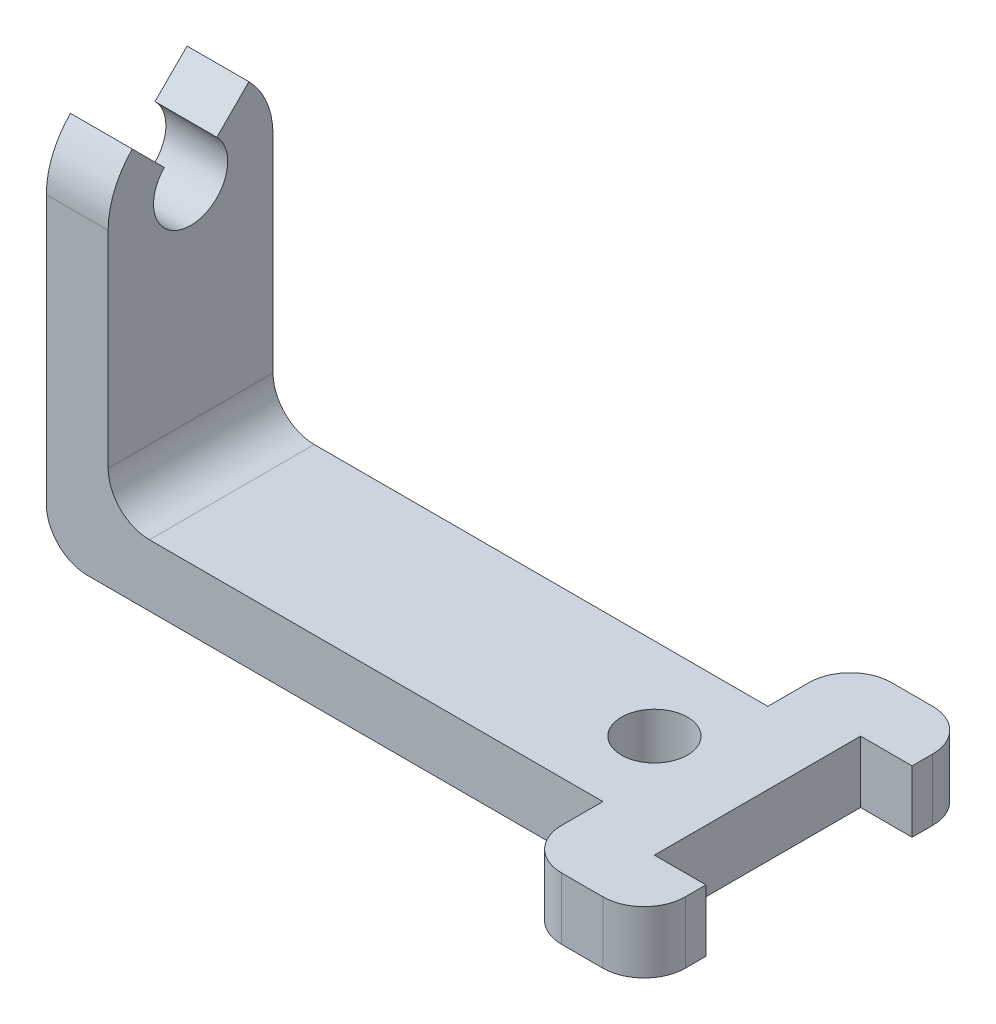
ISO-10303-21;
HEADER;
FILE_DESCRIPTION(('STEP AP214'),'2;1');
FILE_NAME('part.step','',(''),(''),'','','');
FILE_SCHEMA(('AUTOMOTIVE_DESIGN { 1 0 10303 214 1 1 1 1 }'));
ENDSEC;
DATA;
#1=APPLICATION_CONTEXT('core data for automotive mechanical design processes');
#2=APPLICATION_PROTOCOL_DEFINITION('international standard','automotive_design',2000,#1);
#3=PRODUCT_CONTEXT('',#1,'mechanical');
#4=PRODUCT('Part','Part','',(#3));
#5=PRODUCT_RELATED_PRODUCT_CATEGORY('part','',(#4));
#6=PRODUCT_DEFINITION_FORMATION('','',#4);
#7=PRODUCT_DEFINITION_CONTEXT('part definition',#1,'design');
#8=PRODUCT_DEFINITION('design','',#6,#7);
#9=PRODUCT_DEFINITION_SHAPE('','',#8);
#10=(LENGTH_UNIT() NAMED_UNIT(*) SI_UNIT(.MILLI.,.METRE.));
#11=(NAMED_UNIT(*) PLANE_ANGLE_UNIT() SI_UNIT($,.RADIAN.));
#12=(NAMED_UNIT(*) SI_UNIT($,.STERADIAN.) SOLID_ANGLE_UNIT());
#13=UNCERTAINTY_MEASURE_WITH_UNIT(LENGTH_MEASURE(1.E-05),#10,'distance_accuracy_value','');
#14=(GEOMETRIC_REPRESENTATION_CONTEXT(3) GLOBAL_UNCERTAINTY_ASSIGNED_CONTEXT((#13)) GLOBAL_UNIT_ASSIGNED_CONTEXT((#10,
#11,#12)) REPRESENTATION_CONTEXT('',''));
#15=CARTESIAN_POINT('',(0.,0.,0.));
#16=DIRECTION('',(0.,0.,1.));
#17=DIRECTION('',(1.,0.,0.));
#18=AXIS2_PLACEMENT_3D('',#15,#16,#17);
#19=CARTESIAN_POINT('',(0.,3.,0.));
#20=DIRECTION('',(0.,-1.,0.));
#21=DIRECTION('',(0.,0.,-1.));
#22=AXIS2_PLACEMENT_3D('',#19,#20,#21);
#23=PLANE('',#22);
#24=DIRECTION('',(-1.,0.,0.));
#25=VECTOR('',#24,1.);
#26=CARTESIAN_POINT('',(-14.5,3.,-4.));
#27=LINE('',#26,#25);
#28=CARTESIAN_POINT('',(12.5,3.,-4.));
#29=VERTEX_POINT('',#28);
#30=CARTESIAN_POINT('',(-9.50000000000001,3.,-4.));
#31=VERTEX_POINT('',#30);
#32=EDGE_CURVE('E321',#29,#31,#27,.T.);
#33=ORIENTED_EDGE('',*,*,#32,.T.);
#34=DIRECTION('',(0.,0.,1.));
#35=VECTOR('',#34,1.);
#36=CARTESIAN_POINT('',(-9.50000000000001,3.,4.));
#37=LINE('',#36,#35);
#38=CARTESIAN_POINT('',(-9.50000000000001,3.,4.));
#39=VERTEX_POINT('',#38);
#40=EDGE_CURVE('E446',#31,#39,#37,.T.);
#41=ORIENTED_EDGE('',*,*,#40,.T.);
#42=DIRECTION('',(1.,0.,0.));
#43=VECTOR('',#42,1.);
#44=CARTESIAN_POINT('',(-14.5,3.,4.));
#45=LINE('',#44,#43);
#46=CARTESIAN_POINT('',(12.5,3.,4.));
#47=VERTEX_POINT('',#46);
#48=EDGE_CURVE('E325',#39,#47,#45,.T.);
#49=ORIENTED_EDGE('',*,*,#48,.T.);
#50=DIRECTION('',(0.,0.,1.));
#51=VECTOR('',#50,1.);
#52=CARTESIAN_POINT('',(12.5,3.,4.));
#53=LINE('',#52,#51);
#54=CARTESIAN_POINT('',(12.5,3.,6.));
#55=VERTEX_POINT('',#54);
#56=EDGE_CURVE('E289',#47,#55,#53,.T.);
#57=ORIENTED_EDGE('',*,*,#56,.T.);
#58=CARTESIAN_POINT('',(14.5,3.,6.));
#59=DIRECTION('',(0.,-1.,0.));
#60=DIRECTION('',(0.,0.,-1.));
#61=AXIS2_PLACEMENT_3D('',#58,#59,#60);
#62=CIRCLE('',#61,2.);
#63=CARTESIAN_POINT('',(14.5,3.,8.));
#64=VERTEX_POINT('',#63);
#65=EDGE_CURVE('E423',#55,#64,#62,.F.);
#66=ORIENTED_EDGE('',*,*,#65,.T.);
#67=DIRECTION('',(1.,0.,0.));
#68=VECTOR('',#67,1.);
#69=CARTESIAN_POINT('',(18.5,3.,8.));
#70=LINE('',#69,#68);
#71=CARTESIAN_POINT('',(16.5,3.,8.));
#72=VERTEX_POINT('',#71);
#73=EDGE_CURVE('E293',#64,#72,#70,.T.);
#74=ORIENTED_EDGE('',*,*,#73,.T.);
#75=CARTESIAN_POINT('',(16.5,3.,6.));
#76=DIRECTION('',(0.,-1.,0.));
#77=DIRECTION('',(0.,0.,-1.));
#78=AXIS2_PLACEMENT_3D('',#75,#76,#77);
#79=CIRCLE('',#78,2.);
#80=CARTESIAN_POINT('',(18.5,3.,6.));
#81=VERTEX_POINT('',#80);
#82=EDGE_CURVE('E417',#72,#81,#79,.F.);
#83=ORIENTED_EDGE('',*,*,#82,.T.);
#84=DIRECTION('',(0.,0.,-1.));
#85=VECTOR('',#84,1.);
#86=CARTESIAN_POINT('',(18.5,3.,8.));
#87=LINE('',#86,#85);
#88=CARTESIAN_POINT('',(18.5,3.,5.));
#89=VERTEX_POINT('',#88);
#90=EDGE_CURVE('E298',#81,#89,#87,.T.);
#91=ORIENTED_EDGE('',*,*,#90,.T.);
#92=DIRECTION('',(-1.,0.,0.));
#93=VECTOR('',#92,1.);
#94=CARTESIAN_POINT('',(16.,3.,5.));
#95=LINE('',#94,#93);
#96=CARTESIAN_POINT('',(16.,3.,5.));
#97=VERTEX_POINT('',#96);
#98=EDGE_CURVE('E301',#89,#97,#95,.T.);
#99=ORIENTED_EDGE('',*,*,#98,.T.);
#100=DIRECTION('',(0.,0.,-1.));
#101=VECTOR('',#100,1.);
#102=CARTESIAN_POINT('',(16.,3.,5.));
#103=LINE('',#102,#101);
#104=CARTESIAN_POINT('',(16.,3.,-5.));
#105=VERTEX_POINT('',#104);
#106=EDGE_CURVE('E304',#97,#105,#103,.T.);
#107=ORIENTED_EDGE('',*,*,#106,.T.);
#108=DIRECTION('',(1.,0.,0.));
#109=VECTOR('',#108,1.);
#110=CARTESIAN_POINT('',(16.,3.,-5.));
#111=LINE('',#110,#109);
#112=CARTESIAN_POINT('',(18.5,3.,-5.));
#113=VERTEX_POINT('',#112);
#114=EDGE_CURVE('E307',#105,#113,#111,.T.);
#115=ORIENTED_EDGE('',*,*,#114,.T.);
#116=DIRECTION('',(0.,0.,-1.));
#117=VECTOR('',#116,1.);
#118=CARTESIAN_POINT('',(18.5,3.,-5.));
#119=LINE('',#118,#117);
#120=CARTESIAN_POINT('',(18.5,3.,-6.));
#121=VERTEX_POINT('',#120);
#122=EDGE_CURVE('E310',#113,#121,#119,.T.);
#123=ORIENTED_EDGE('',*,*,#122,.T.);
#124=CARTESIAN_POINT('',(16.5,3.,-6.));
#125=DIRECTION('',(0.,-1.,0.));
#126=DIRECTION('',(0.,0.,-1.));
#127=AXIS2_PLACEMENT_3D('',#124,#125,#126);
#128=CIRCLE('',#127,2.);
#129=CARTESIAN_POINT('',(16.5,3.,-8.));
#130=VERTEX_POINT('',#129);
#131=EDGE_CURVE('E420',#121,#130,#128,.F.);
#132=ORIENTED_EDGE('',*,*,#131,.T.);
#133=DIRECTION('',(-1.,0.,0.));
#134=VECTOR('',#133,1.);
#135=CARTESIAN_POINT('',(18.5,3.,-8.));
#136=LINE('',#135,#134);
#137=CARTESIAN_POINT('',(14.5,3.,-8.));
#138=VERTEX_POINT('',#137);
#139=EDGE_CURVE('E314',#130,#138,#136,.T.);
#140=ORIENTED_EDGE('',*,*,#139,.T.);
#141=CARTESIAN_POINT('',(14.5,3.,-6.));
#142=DIRECTION('',(0.,-1.,0.));
#143=DIRECTION('',(0.,0.,-1.));
#144=AXIS2_PLACEMENT_3D('',#141,#142,#143);
#145=CIRCLE('',#144,2.);
#146=CARTESIAN_POINT('',(12.5,3.,-6.));
#147=VERTEX_POINT('',#146);
#148=EDGE_CURVE('E426',#138,#147,#145,.F.);
#149=ORIENTED_EDGE('',*,*,#148,.T.);
#150=DIRECTION('',(0.,0.,1.));
#151=VECTOR('',#150,1.);
#152=CARTESIAN_POINT('',(12.5,3.,-8.));
#153=LINE('',#152,#151);
#154=EDGE_CURVE('E318',#147,#29,#153,.T.);
#155=ORIENTED_EDGE('',*,*,#154,.T.);
#156=EDGE_LOOP('',(#33,#41,#49,#57,#66,#74,#83,#91,#99,#107,#115,#123,#132,#140,#149,#155));
#157=FACE_BOUND('',#156,.T.);
#158=CARTESIAN_POINT('',(11.,3.,0.));
#159=DIRECTION('',(0.,1.,0.));
#160=DIRECTION('',(0.,0.,1.));
#161=AXIS2_PLACEMENT_3D('',#158,#159,#160);
#162=CIRCLE('',#161,1.6);
#163=CARTESIAN_POINT('',(11.,3.,1.6));
#164=VERTEX_POINT('',#163);
#165=EDGE_CURVE('E281',#164,#164,#162,.T.);
#166=ORIENTED_EDGE('',*,*,#165,.F.);
#167=EDGE_LOOP('',(#166));
#168=FACE_BOUND('',#167,.T.);
#169=ADVANCED_FACE('F39',(#157,#168),#23,.F.);
#170=CARTESIAN_POINT('',(0.,0.,0.));
#171=DIRECTION('',(0.,-1.,0.));
#172=DIRECTION('',(0.,0.,-1.));
#173=AXIS2_PLACEMENT_3D('',#170,#171,#172);
#174=PLANE('',#173);
#175=DIRECTION('',(1.,0.,0.));
#176=VECTOR('',#175,1.);
#177=CARTESIAN_POINT('',(-14.5,0.,4.));
#178=LINE('',#177,#176);
#179=CARTESIAN_POINT('',(-12.5,0.,4.));
#180=VERTEX_POINT('',#179);
#181=CARTESIAN_POINT('',(12.5,0.,4.));
#182=VERTEX_POINT('',#181);
#183=EDGE_CURVE('E294',#180,#182,#178,.T.);
#184=ORIENTED_EDGE('',*,*,#183,.F.);
#185=DIRECTION('',(0.,0.,1.));
#186=VECTOR('',#185,1.);
#187=CARTESIAN_POINT('',(-12.5,0.,-4.));
#188=LINE('',#187,#186);
#189=CARTESIAN_POINT('',(-12.5,0.,-4.));
#190=VERTEX_POINT('',#189);
#191=EDGE_CURVE('E55',#180,#190,#188,.F.);
#192=ORIENTED_EDGE('',*,*,#191,.T.);
#193=DIRECTION('',(-1.,0.,0.));
#194=VECTOR('',#193,1.);
#195=CARTESIAN_POINT('',(-14.5,0.,-4.));
#196=LINE('',#195,#194);
#197=CARTESIAN_POINT('',(12.5,0.,-4.));
#198=VERTEX_POINT('',#197);
#199=EDGE_CURVE('E359',#198,#190,#196,.T.);
#200=ORIENTED_EDGE('',*,*,#199,.F.);
#201=DIRECTION('',(0.,0.,1.));
#202=VECTOR('',#201,1.);
#203=CARTESIAN_POINT('',(12.5,0.,-8.));
#204=LINE('',#203,#202);
#205=CARTESIAN_POINT('',(12.5,0.,-6.));
#206=VERTEX_POINT('',#205);
#207=EDGE_CURVE('E356',#206,#198,#204,.T.);
#208=ORIENTED_EDGE('',*,*,#207,.F.);
#209=CARTESIAN_POINT('',(14.5,0.,-6.));
#210=DIRECTION('',(0.,-1.,0.));
#211=DIRECTION('',(0.,0.,-1.));
#212=AXIS2_PLACEMENT_3D('',#209,#210,#211);
#213=CIRCLE('',#212,2.);
#214=CARTESIAN_POINT('',(14.5,0.,-8.));
#215=VERTEX_POINT('',#214);
#216=EDGE_CURVE('E407',#206,#215,#213,.T.);
#217=ORIENTED_EDGE('',*,*,#216,.T.);
#218=DIRECTION('',(-1.,0.,0.));
#219=VECTOR('',#218,1.);
#220=CARTESIAN_POINT('',(18.5,0.,-8.));
#221=LINE('',#220,#219);
#222=CARTESIAN_POINT('',(16.5,0.,-8.));
#223=VERTEX_POINT('',#222);
#224=EDGE_CURVE('E352',#223,#215,#221,.T.);
#225=ORIENTED_EDGE('',*,*,#224,.F.);
#226=CARTESIAN_POINT('',(16.5,0.,-6.));
#227=DIRECTION('',(0.,-1.,0.));
#228=DIRECTION('',(0.,0.,-1.));
#229=AXIS2_PLACEMENT_3D('',#226,#227,#228);
#230=CIRCLE('',#229,2.);
#231=CARTESIAN_POINT('',(18.5,0.,-6.));
#232=VERTEX_POINT('',#231);
#233=EDGE_CURVE('E401',#223,#232,#230,.T.);
#234=ORIENTED_EDGE('',*,*,#233,.T.);
#235=DIRECTION('',(0.,0.,-1.));
#236=VECTOR('',#235,1.);
#237=CARTESIAN_POINT('',(18.5,0.,-5.));
#238=LINE('',#237,#236);
#239=CARTESIAN_POINT('',(18.5,0.,-5.));
#240=VERTEX_POINT('',#239);
#241=EDGE_CURVE('E348',#240,#232,#238,.T.);
#242=ORIENTED_EDGE('',*,*,#241,.F.);
#243=DIRECTION('',(1.,0.,0.));
#244=VECTOR('',#243,1.);
#245=CARTESIAN_POINT('',(16.,0.,-5.));
#246=LINE('',#245,#244);
#247=CARTESIAN_POINT('',(16.,0.,-5.));
#248=VERTEX_POINT('',#247);
#249=EDGE_CURVE('E345',#248,#240,#246,.T.);
#250=ORIENTED_EDGE('',*,*,#249,.F.);
#251=DIRECTION('',(0.,0.,-1.));
#252=VECTOR('',#251,1.);
#253=CARTESIAN_POINT('',(16.,0.,5.));
#254=LINE('',#253,#252);
#255=CARTESIAN_POINT('',(16.,0.,5.));
#256=VERTEX_POINT('',#255);
#257=EDGE_CURVE('E342',#256,#248,#254,.T.);
#258=ORIENTED_EDGE('',*,*,#257,.F.);
#259=DIRECTION('',(-1.,0.,0.));
#260=VECTOR('',#259,1.);
#261=CARTESIAN_POINT('',(16.,0.,5.));
#262=LINE('',#261,#260);
#263=CARTESIAN_POINT('',(18.5,0.,5.));
#264=VERTEX_POINT('',#263);
#265=EDGE_CURVE('E339',#264,#256,#262,.T.);
#266=ORIENTED_EDGE('',*,*,#265,.F.);
#267=DIRECTION('',(0.,0.,-1.));
#268=VECTOR('',#267,1.);
#269=CARTESIAN_POINT('',(18.5,0.,8.));
#270=LINE('',#269,#268);
#271=CARTESIAN_POINT('',(18.5,0.,6.));
#272=VERTEX_POINT('',#271);
#273=EDGE_CURVE('E336',#272,#264,#270,.T.);
#274=ORIENTED_EDGE('',*,*,#273,.F.);
#275=CARTESIAN_POINT('',(16.5,0.,6.));
#276=DIRECTION('',(0.,-1.,0.));
#277=DIRECTION('',(0.,0.,-1.));
#278=AXIS2_PLACEMENT_3D('',#275,#276,#277);
#279=CIRCLE('',#278,2.);
#280=CARTESIAN_POINT('',(16.5,0.,8.));
#281=VERTEX_POINT('',#280);
#282=EDGE_CURVE('E398',#272,#281,#279,.T.);
#283=ORIENTED_EDGE('',*,*,#282,.T.);
#284=DIRECTION('',(1.,0.,0.));
#285=VECTOR('',#284,1.);
#286=CARTESIAN_POINT('',(18.5,0.,8.));
#287=LINE('',#286,#285);
#288=CARTESIAN_POINT('',(14.5,0.,8.));
#289=VERTEX_POINT('',#288);
#290=EDGE_CURVE('E332',#289,#281,#287,.T.);
#291=ORIENTED_EDGE('',*,*,#290,.F.);
#292=CARTESIAN_POINT('',(14.5,0.,6.));
#293=DIRECTION('',(0.,-1.,0.));
#294=DIRECTION('',(0.,0.,-1.));
#295=AXIS2_PLACEMENT_3D('',#292,#293,#294);
#296=CIRCLE('',#295,2.);
#297=CARTESIAN_POINT('',(12.5,0.,6.));
#298=VERTEX_POINT('',#297);
#299=EDGE_CURVE('E404',#289,#298,#296,.T.);
#300=ORIENTED_EDGE('',*,*,#299,.T.);
#301=DIRECTION('',(0.,0.,1.));
#302=VECTOR('',#301,1.);
#303=CARTESIAN_POINT('',(12.5,0.,4.));
#304=LINE('',#303,#302);
#305=EDGE_CURVE('E285',#182,#298,#304,.T.);
#306=ORIENTED_EDGE('',*,*,#305,.F.);
#307=EDGE_LOOP('',(#184,#192,#200,#208,#217,#225,#234,#242,#250,#258,#266,#274,#283,#291,#300,#306));
#308=FACE_BOUND('',#307,.T.);
#309=CARTESIAN_POINT('',(11.,0.,0.));
#310=DIRECTION('',(0.,1.,0.));
#311=DIRECTION('',(0.,0.,1.));
#312=AXIS2_PLACEMENT_3D('',#309,#310,#311);
#313=CIRCLE('',#312,1.6);
#314=CARTESIAN_POINT('',(11.,0.,1.6));
#315=VERTEX_POINT('',#314);
#316=EDGE_CURVE('E267',#315,#315,#313,.T.);
#317=ORIENTED_EDGE('',*,*,#316,.T.);
#318=EDGE_LOOP('',(#317));
#319=FACE_BOUND('',#318,.T.);
#320=ADVANCED_FACE('F487',(#308,#319),#174,.T.);
#321=CARTESIAN_POINT('',(12.5,3.,4.));
#322=DIRECTION('',(1.,0.,0.));
#323=DIRECTION('',(0.,0.,-1.));
#324=AXIS2_PLACEMENT_3D('',#321,#322,#323);
#325=PLANE('',#324);
#326=ORIENTED_EDGE('',*,*,#305,.T.);
#327=DIRECTION('',(0.,-1.,0.));
#328=VECTOR('',#327,1.);
#329=CARTESIAN_POINT('',(12.5,3.,6.));
#330=LINE('',#329,#328);
#331=EDGE_CURVE('E436',#298,#55,#330,.F.);
#332=ORIENTED_EDGE('',*,*,#331,.T.);
#333=ORIENTED_EDGE('',*,*,#56,.F.);
#334=DIRECTION('',(0.,-1.,0.));
#335=VECTOR('',#334,1.);
#336=CARTESIAN_POINT('',(12.5,3.,4.));
#337=LINE('',#336,#335);
#338=EDGE_CURVE('E328',#47,#182,#337,.T.);
#339=ORIENTED_EDGE('',*,*,#338,.T.);
#340=EDGE_LOOP('',(#326,#332,#333,#339));
#341=FACE_BOUND('',#340,.T.);
#342=ADVANCED_FACE('F514',(#341),#325,.F.);
#343=CARTESIAN_POINT('',(18.5,3.,8.));
#344=DIRECTION('',(0.,0.,-1.));
#345=DIRECTION('',(-1.,0.,0.));
#346=AXIS2_PLACEMENT_3D('',#343,#344,#345);
#347=PLANE('',#346);
#348=ORIENTED_EDGE('',*,*,#73,.F.);
#349=DIRECTION('',(0.,-1.,0.));
#350=VECTOR('',#349,1.);
#351=CARTESIAN_POINT('',(14.5,3.,8.));
#352=LINE('',#351,#350);
#353=EDGE_CURVE('E432',#64,#289,#352,.T.);
#354=ORIENTED_EDGE('',*,*,#353,.T.);
#355=ORIENTED_EDGE('',*,*,#290,.T.);
#356=DIRECTION('',(0.,-1.,0.));
#357=VECTOR('',#356,1.);
#358=CARTESIAN_POINT('',(16.5,3.,8.));
#359=LINE('',#358,#357);
#360=EDGE_CURVE('E429',#281,#72,#359,.F.);
#361=ORIENTED_EDGE('',*,*,#360,.T.);
#362=EDGE_LOOP('',(#348,#354,#355,#361));
#363=FACE_BOUND('',#362,.T.);
#364=ADVANCED_FACE('F551',(#363),#347,.F.);
#365=CARTESIAN_POINT('',(18.5,3.,8.));
#366=DIRECTION('',(-1.,0.,0.));
#367=DIRECTION('',(0.,0.,1.));
#368=AXIS2_PLACEMENT_3D('',#365,#366,#367);
#369=PLANE('',#368);
#370=ORIENTED_EDGE('',*,*,#90,.F.);
#371=DIRECTION('',(0.,-1.,0.));
#372=VECTOR('',#371,1.);
#373=CARTESIAN_POINT('',(18.5,3.,6.));
#374=LINE('',#373,#372);
#375=EDGE_CURVE('E442',#81,#272,#374,.T.);
#376=ORIENTED_EDGE('',*,*,#375,.T.);
#377=ORIENTED_EDGE('',*,*,#273,.T.);
#378=DIRECTION('',(0.,-1.,0.));
#379=VECTOR('',#378,1.);
#380=CARTESIAN_POINT('',(18.5,3.,5.));
#381=LINE('',#380,#379);
#382=EDGE_CURVE('E390',#89,#264,#381,.T.);
#383=ORIENTED_EDGE('',*,*,#382,.F.);
#384=EDGE_LOOP('',(#370,#376,#377,#383));
#385=FACE_BOUND('',#384,.T.);
#386=ADVANCED_FACE('F547',(#385),#369,.F.);
#387=CARTESIAN_POINT('',(16.,3.,5.));
#388=DIRECTION('',(0.,0.,1.));
#389=DIRECTION('',(1.,0.,0.));
#390=AXIS2_PLACEMENT_3D('',#387,#388,#389);
#391=PLANE('',#390);
#392=ORIENTED_EDGE('',*,*,#265,.T.);
#393=DIRECTION('',(0.,-1.,0.));
#394=VECTOR('',#393,1.);
#395=CARTESIAN_POINT('',(16.,3.,5.));
#396=LINE('',#395,#394);
#397=EDGE_CURVE('E386',#97,#256,#396,.T.);
#398=ORIENTED_EDGE('',*,*,#397,.F.);
#399=ORIENTED_EDGE('',*,*,#98,.F.);
#400=ORIENTED_EDGE('',*,*,#382,.T.);
#401=EDGE_LOOP('',(#392,#398,#399,#400));
#402=FACE_BOUND('',#401,.T.);
#403=ADVANCED_FACE('F543',(#402),#391,.F.);
#404=CARTESIAN_POINT('',(16.,3.,5.));
#405=DIRECTION('',(-1.,0.,0.));
#406=DIRECTION('',(0.,0.,1.));
#407=AXIS2_PLACEMENT_3D('',#404,#405,#406);
#408=PLANE('',#407);
#409=ORIENTED_EDGE('',*,*,#257,.T.);
#410=DIRECTION('',(0.,-1.,0.));
#411=VECTOR('',#410,1.);
#412=CARTESIAN_POINT('',(16.,3.,-5.));
#413=LINE('',#412,#411);
#414=EDGE_CURVE('E382',#105,#248,#413,.T.);
#415=ORIENTED_EDGE('',*,*,#414,.F.);
#416=ORIENTED_EDGE('',*,*,#106,.F.);
#417=ORIENTED_EDGE('',*,*,#397,.T.);
#418=EDGE_LOOP('',(#409,#415,#416,#417));
#419=FACE_BOUND('',#418,.T.);
#420=ADVANCED_FACE('F539',(#419),#408,.F.);
#421=CARTESIAN_POINT('',(16.,3.,-5.));
#422=DIRECTION('',(0.,0.,-1.));
#423=DIRECTION('',(-1.,0.,0.));
#424=AXIS2_PLACEMENT_3D('',#421,#422,#423);
#425=PLANE('',#424);
#426=ORIENTED_EDGE('',*,*,#249,.T.);
#427=DIRECTION('',(0.,-1.,0.));
#428=VECTOR('',#427,1.);
#429=CARTESIAN_POINT('',(18.5,3.,-5.));
#430=LINE('',#429,#428);
#431=EDGE_CURVE('E378',#113,#240,#430,.T.);
#432=ORIENTED_EDGE('',*,*,#431,.F.);
#433=ORIENTED_EDGE('',*,*,#114,.F.);
#434=ORIENTED_EDGE('',*,*,#414,.T.);
#435=EDGE_LOOP('',(#426,#432,#433,#434));
#436=FACE_BOUND('',#435,.T.);
#437=ADVANCED_FACE('F535',(#436),#425,.F.);
#438=CARTESIAN_POINT('',(18.5,3.,-5.));
#439=DIRECTION('',(-1.,0.,0.));
#440=DIRECTION('',(0.,0.,1.));
#441=AXIS2_PLACEMENT_3D('',#438,#439,#440);
#442=PLANE('',#441);
#443=ORIENTED_EDGE('',*,*,#241,.T.);
#444=DIRECTION('',(0.,-1.,0.));
#445=VECTOR('',#444,1.);
#446=CARTESIAN_POINT('',(18.5,3.,-6.));
#447=LINE('',#446,#445);
#448=EDGE_CURVE('E439',#232,#121,#447,.F.);
#449=ORIENTED_EDGE('',*,*,#448,.T.);
#450=ORIENTED_EDGE('',*,*,#122,.F.);
#451=ORIENTED_EDGE('',*,*,#431,.T.);
#452=EDGE_LOOP('',(#443,#449,#450,#451));
#453=FACE_BOUND('',#452,.T.);
#454=ADVANCED_FACE('F532',(#453),#442,.F.);
#455=CARTESIAN_POINT('',(18.5,3.,-8.));
#456=DIRECTION('',(0.,0.,1.));
#457=DIRECTION('',(1.,0.,0.));
#458=AXIS2_PLACEMENT_3D('',#455,#456,#457);
#459=PLANE('',#458);
#460=ORIENTED_EDGE('',*,*,#224,.T.);
#461=DIRECTION('',(0.,-1.,0.));
#462=VECTOR('',#461,1.);
#463=CARTESIAN_POINT('',(14.5,3.,-8.));
#464=LINE('',#463,#462);
#465=EDGE_CURVE('E414',#215,#138,#464,.F.);
#466=ORIENTED_EDGE('',*,*,#465,.T.);
#467=ORIENTED_EDGE('',*,*,#139,.F.);
#468=DIRECTION('',(0.,-1.,0.));
#469=VECTOR('',#468,1.);
#470=CARTESIAN_POINT('',(16.5,3.,-8.));
#471=LINE('',#470,#469);
#472=EDGE_CURVE('E410',#130,#223,#471,.T.);
#473=ORIENTED_EDGE('',*,*,#472,.T.);
#474=EDGE_LOOP('',(#460,#466,#467,#473));
#475=FACE_BOUND('',#474,.T.);
#476=ADVANCED_FACE('F493',(#475),#459,.F.);
#477=CARTESIAN_POINT('',(12.5,3.,-8.));
#478=DIRECTION('',(1.,0.,0.));
#479=DIRECTION('',(0.,0.,-1.));
#480=AXIS2_PLACEMENT_3D('',#477,#478,#479);
#481=PLANE('',#480);
#482=ORIENTED_EDGE('',*,*,#154,.F.);
#483=DIRECTION('',(0.,-1.,0.));
#484=VECTOR('',#483,1.);
#485=CARTESIAN_POINT('',(12.5,3.,-6.));
#486=LINE('',#485,#484);
#487=EDGE_CURVE('E394',#147,#206,#486,.T.);
#488=ORIENTED_EDGE('',*,*,#487,.T.);
#489=ORIENTED_EDGE('',*,*,#207,.T.);
#490=DIRECTION('',(0.,-1.,0.));
#491=VECTOR('',#490,1.);
#492=CARTESIAN_POINT('',(12.5,3.,-4.));
#493=LINE('',#492,#491);
#494=EDGE_CURVE('E374',#29,#198,#493,.T.);
#495=ORIENTED_EDGE('',*,*,#494,.F.);
#496=EDGE_LOOP('',(#482,#488,#489,#495));
#497=FACE_BOUND('',#496,.T.);
#498=ADVANCED_FACE('F484',(#497),#481,.F.);
#499=CARTESIAN_POINT('',(-14.5,3.,-4.));
#500=DIRECTION('',(0.,0.,1.));
#501=DIRECTION('',(1.,0.,0.));
#502=AXIS2_PLACEMENT_3D('',#499,#500,#501);
#503=PLANE('',#502);
#504=ORIENTED_EDGE('',*,*,#199,.T.);
#505=CARTESIAN_POINT('',(-12.5,2.,-4.));
#506=DIRECTION('',(0.,0.,1.));
#507=DIRECTION('',(1.,0.,0.));
#508=AXIS2_PLACEMENT_3D('',#505,#506,#507);
#509=CIRCLE('',#508,2.);
#510=CARTESIAN_POINT('',(-14.5,2.,-4.));
#511=VERTEX_POINT('',#510);
#512=EDGE_CURVE('E461',#190,#511,#509,.F.);
#513=ORIENTED_EDGE('',*,*,#512,.T.);
#514=DIRECTION('',(0.,-1.,0.));
#515=VECTOR('',#514,1.);
#516=CARTESIAN_POINT('',(-14.5,3.,-4.));
#517=LINE('',#516,#515);
#518=CARTESIAN_POINT('',(-14.5,15.,-4.));
#519=VERTEX_POINT('',#518);
#520=EDGE_CURVE('E370',#519,#511,#517,.T.);
#521=ORIENTED_EDGE('',*,*,#520,.F.);
#522=DIRECTION('',(-1.,0.,0.));
#523=VECTOR('',#522,1.);
#524=CARTESIAN_POINT('',(-11.5,15.,-4.));
#525=LINE('',#524,#523);
#526=CARTESIAN_POINT('',(-11.5,15.,-4.));
#527=VERTEX_POINT('',#526);
#528=EDGE_CURVE('E275',#527,#519,#525,.T.);
#529=ORIENTED_EDGE('',*,*,#528,.F.);
#530=DIRECTION('',(0.,-1.,0.));
#531=VECTOR('',#530,1.);
#532=CARTESIAN_POINT('',(-11.5,15.,-4.));
#533=LINE('',#532,#531);
#534=CARTESIAN_POINT('',(-11.5,5.,-3.99999999999999));
#535=VERTEX_POINT('',#534);
#536=EDGE_CURVE('E240',#527,#535,#533,.T.);
#537=ORIENTED_EDGE('',*,*,#536,.T.);
#538=CARTESIAN_POINT('',(-9.50000000000001,5.,-4.));
#539=DIRECTION('',(0.,0.,1.));
#540=DIRECTION('',(1.,0.,0.));
#541=AXIS2_PLACEMENT_3D('',#538,#539,#540);
#542=CIRCLE('',#541,2.);
#543=EDGE_CURVE('E11',#535,#31,#542,.T.);
#544=ORIENTED_EDGE('',*,*,#543,.T.);
#545=ORIENTED_EDGE('',*,*,#32,.F.);
#546=ORIENTED_EDGE('',*,*,#494,.T.);
#547=EDGE_LOOP('',(#504,#513,#521,#529,#537,#544,#545,#546));
#548=FACE_BOUND('',#547,.T.);
#549=ADVANCED_FACE('F476',(#548),#503,.F.);
#550=CARTESIAN_POINT('',(-14.5,3.,4.));
#551=DIRECTION('',(1.,0.,0.));
#552=DIRECTION('',(0.,0.,-1.));
#553=AXIS2_PLACEMENT_3D('',#550,#551,#552);
#554=PLANE('',#553);
#555=ORIENTED_EDGE('',*,*,#520,.T.);
#556=DIRECTION('',(0.,0.,1.));
#557=VECTOR('',#556,1.);
#558=CARTESIAN_POINT('',(-14.5,2.,4.));
#559=LINE('',#558,#557);
#560=CARTESIAN_POINT('',(-14.5,2.,4.));
#561=VERTEX_POINT('',#560);
#562=EDGE_CURVE('E453',#511,#561,#559,.T.);
#563=ORIENTED_EDGE('',*,*,#562,.T.);
#564=DIRECTION('',(0.,-1.,0.));
#565=VECTOR('',#564,1.);
#566=CARTESIAN_POINT('',(-14.5,3.,4.));
#567=LINE('',#566,#565);
#568=CARTESIAN_POINT('',(-14.5,15.,4.));
#569=VERTEX_POINT('',#568);
#570=EDGE_CURVE('E367',#569,#561,#567,.T.);
#571=ORIENTED_EDGE('',*,*,#570,.F.);
#572=CARTESIAN_POINT('',(-14.5,15.,0.));
#573=DIRECTION('',(-1.,0.,0.));
#574=DIRECTION('',(0.,0.,1.));
#575=AXIS2_PLACEMENT_3D('',#572,#573,#574);
#576=CIRCLE('',#575,4.);
#577=CARTESIAN_POINT('',(-14.5,17.8284271247462,2.8284271247462));
#578=VERTEX_POINT('',#577);
#579=EDGE_CURVE('E235',#569,#578,#576,.T.);
#580=ORIENTED_EDGE('',*,*,#579,.T.);
#581=DIRECTION('',(0.,-0.707106781186546,-0.707106781186549));
#582=VECTOR('',#581,1.);
#583=CARTESIAN_POINT('',(-14.5,16.2727922061358,1.27279220613579));
#584=LINE('',#583,#582);
#585=CARTESIAN_POINT('',(-14.5,16.2727922061358,1.27279220613579));
#586=VERTEX_POINT('',#585);
#587=EDGE_CURVE('E231',#578,#586,#584,.T.);
#588=ORIENTED_EDGE('',*,*,#587,.T.);
#589=CARTESIAN_POINT('',(-14.5,15.,0.));
#590=DIRECTION('',(1.,0.,0.));
#591=DIRECTION('',(0.,0.,1.));
#592=AXIS2_PLACEMENT_3D('',#589,#590,#591);
#593=CIRCLE('',#592,1.8);
#594=CARTESIAN_POINT('',(-14.5,16.2727922061358,-1.27279220613579));
#595=VERTEX_POINT('',#594);
#596=EDGE_CURVE('E253',#586,#595,#593,.T.);
#597=ORIENTED_EDGE('',*,*,#596,.T.);
#598=DIRECTION('',(0.,0.707106781186546,-0.707106781186549));
#599=VECTOR('',#598,1.);
#600=CARTESIAN_POINT('',(-14.5,16.2727922061358,-1.27279220613579));
#601=LINE('',#600,#599);
#602=CARTESIAN_POINT('',(-14.5,17.8284271247462,-2.82842712474619));
#603=VERTEX_POINT('',#602);
#604=EDGE_CURVE('E206',#595,#603,#601,.T.);
#605=ORIENTED_EDGE('',*,*,#604,.T.);
#606=CARTESIAN_POINT('',(-14.5,15.,0.));
#607=DIRECTION('',(-1.,0.,0.));
#608=DIRECTION('',(0.,0.,1.));
#609=AXIS2_PLACEMENT_3D('',#606,#607,#608);
#610=CIRCLE('',#609,4.);
#611=EDGE_CURVE('E258',#603,#519,#610,.T.);
#612=ORIENTED_EDGE('',*,*,#611,.T.);
#613=EDGE_LOOP('',(#555,#563,#571,#580,#588,#597,#605,#612));
#614=FACE_BOUND('',#613,.T.);
#615=ADVANCED_FACE('F522',(#614),#554,.F.);
#616=CARTESIAN_POINT('',(-14.5,3.,4.));
#617=DIRECTION('',(0.,0.,-1.));
#618=DIRECTION('',(-1.,0.,0.));
#619=AXIS2_PLACEMENT_3D('',#616,#617,#618);
#620=PLANE('',#619);
#621=ORIENTED_EDGE('',*,*,#570,.T.);
#622=CARTESIAN_POINT('',(-12.5,2.,4.));
#623=DIRECTION('',(0.,0.,-1.));
#624=DIRECTION('',(-1.,0.,0.));
#625=AXIS2_PLACEMENT_3D('',#622,#623,#624);
#626=CIRCLE('',#625,2.);
#627=EDGE_CURVE('E63',#561,#180,#626,.F.);
#628=ORIENTED_EDGE('',*,*,#627,.T.);
#629=ORIENTED_EDGE('',*,*,#183,.T.);
#630=ORIENTED_EDGE('',*,*,#338,.F.);
#631=ORIENTED_EDGE('',*,*,#48,.F.);
#632=CARTESIAN_POINT('',(-9.50000000000001,5.,4.));
#633=DIRECTION('',(0.,0.,-1.));
#634=DIRECTION('',(-1.,0.,0.));
#635=AXIS2_PLACEMENT_3D('',#632,#633,#634);
#636=CIRCLE('',#635,2.);
#637=CARTESIAN_POINT('',(-11.5,5.,4.));
#638=VERTEX_POINT('',#637);
#639=EDGE_CURVE('E48',#39,#638,#636,.T.);
#640=ORIENTED_EDGE('',*,*,#639,.T.);
#641=DIRECTION('',(0.,1.,0.));
#642=VECTOR('',#641,1.);
#643=CARTESIAN_POINT('',(-11.5,3.,4.));
#644=LINE('',#643,#642);
#645=CARTESIAN_POINT('',(-11.5,15.,4.));
#646=VERTEX_POINT('',#645);
#647=EDGE_CURVE('E244',#638,#646,#644,.T.);
#648=ORIENTED_EDGE('',*,*,#647,.T.);
#649=DIRECTION('',(-1.,0.,0.));
#650=VECTOR('',#649,1.);
#651=CARTESIAN_POINT('',(-11.5,15.,4.));
#652=LINE('',#651,#650);
#653=EDGE_CURVE('E271',#646,#569,#652,.T.);
#654=ORIENTED_EDGE('',*,*,#653,.T.);
#655=EDGE_LOOP('',(#621,#628,#629,#630,#631,#640,#648,#654));
#656=FACE_BOUND('',#655,.T.);
#657=ADVANCED_FACE('F465',(#656),#620,.F.);
#658=CARTESIAN_POINT('',(11.,3.,0.));
#659=DIRECTION('',(0.,-1.,0.));
#660=DIRECTION('',(0.,0.,-1.));
#661=AXIS2_PLACEMENT_3D('',#658,#659,#660);
#662=CYLINDRICAL_SURFACE('',#661,1.6);
#663=ORIENTED_EDGE('',*,*,#165,.T.);
#664=EDGE_LOOP('',(#663));
#665=FACE_BOUND('',#664,.T.);
#666=ORIENTED_EDGE('',*,*,#316,.F.);
#667=EDGE_LOOP('',(#666));
#668=FACE_BOUND('',#667,.T.);
#669=ADVANCED_FACE('F517',(#665,#668),#662,.F.);
#670=CARTESIAN_POINT('',(-11.5,15.,0.));
#671=DIRECTION('',(-1.,0.,0.));
#672=DIRECTION('',(0.,0.,1.));
#673=AXIS2_PLACEMENT_3D('',#670,#671,#672);
#674=CYLINDRICAL_SURFACE('',#673,1.8);
#675=ORIENTED_EDGE('',*,*,#596,.F.);
#676=DIRECTION('',(-1.,0.,0.));
#677=VECTOR('',#676,1.);
#678=CARTESIAN_POINT('',(-11.5,16.2727922061358,1.27279220613579));
#679=LINE('',#678,#677);
#680=CARTESIAN_POINT('',(-11.5,16.2727922061358,1.27279220613579));
#681=VERTEX_POINT('',#680);
#682=EDGE_CURVE('E229',#681,#586,#679,.T.);
#683=ORIENTED_EDGE('',*,*,#682,.F.);
#684=CARTESIAN_POINT('',(-11.5,15.,0.));
#685=DIRECTION('',(1.,0.,0.));
#686=DIRECTION('',(0.,0.,1.));
#687=AXIS2_PLACEMENT_3D('',#684,#685,#686);
#688=CIRCLE('',#687,1.8);
#689=CARTESIAN_POINT('',(-11.5,16.2727922061358,-1.27279220613579));
#690=VERTEX_POINT('',#689);
#691=EDGE_CURVE('E221',#681,#690,#688,.T.);
#692=ORIENTED_EDGE('',*,*,#691,.T.);
#693=DIRECTION('',(-1.,0.,0.));
#694=VECTOR('',#693,1.);
#695=CARTESIAN_POINT('',(-11.5,16.2727922061358,-1.27279220613579));
#696=LINE('',#695,#694);
#697=EDGE_CURVE('E201',#690,#595,#696,.T.);
#698=ORIENTED_EDGE('',*,*,#697,.T.);
#699=EDGE_LOOP('',(#675,#683,#692,#698));
#700=FACE_BOUND('',#699,.T.);
#701=ADVANCED_FACE('F228',(#700),#674,.F.);
#702=CARTESIAN_POINT('',(-11.5,16.2727922061358,1.27279220613579));
#703=DIRECTION('',(0.,0.707106781186549,-0.707106781186546));
#704=DIRECTION('',(0.,0.707106781186546,0.707106781186549));
#705=AXIS2_PLACEMENT_3D('',#702,#703,#704);
#706=PLANE('',#705);
#707=ORIENTED_EDGE('',*,*,#587,.F.);
#708=DIRECTION('',(-1.,0.,0.));
#709=VECTOR('',#708,1.);
#710=CARTESIAN_POINT('',(-11.5,17.8284271247462,2.8284271247462));
#711=LINE('',#710,#709);
#712=CARTESIAN_POINT('',(-11.5,17.8284271247462,2.8284271247462));
#713=VERTEX_POINT('',#712);
#714=EDGE_CURVE('E268',#713,#578,#711,.T.);
#715=ORIENTED_EDGE('',*,*,#714,.F.);
#716=DIRECTION('',(0.,-0.707106781186546,-0.707106781186549));
#717=VECTOR('',#716,1.);
#718=CARTESIAN_POINT('',(-11.5,16.2727922061358,1.27279220613579));
#719=LINE('',#718,#717);
#720=EDGE_CURVE('E213',#713,#681,#719,.T.);
#721=ORIENTED_EDGE('',*,*,#720,.T.);
#722=ORIENTED_EDGE('',*,*,#682,.T.);
#723=EDGE_LOOP('',(#707,#715,#721,#722));
#724=FACE_BOUND('',#723,.T.);
#725=ADVANCED_FACE('F613',(#724),#706,.T.);
#726=CARTESIAN_POINT('',(-11.5,15.,0.));
#727=DIRECTION('',(-1.,0.,0.));
#728=DIRECTION('',(0.,0.,1.));
#729=AXIS2_PLACEMENT_3D('',#726,#727,#728);
#730=CYLINDRICAL_SURFACE('',#729,4.);
#731=ORIENTED_EDGE('',*,*,#579,.F.);
#732=ORIENTED_EDGE('',*,*,#653,.F.);
#733=CARTESIAN_POINT('',(-11.5,15.,0.));
#734=DIRECTION('',(-1.,0.,0.));
#735=DIRECTION('',(0.,0.,1.));
#736=AXIS2_PLACEMENT_3D('',#733,#734,#735);
#737=CIRCLE('',#736,4.);
#738=EDGE_CURVE('E247',#646,#713,#737,.T.);
#739=ORIENTED_EDGE('',*,*,#738,.T.);
#740=ORIENTED_EDGE('',*,*,#714,.T.);
#741=EDGE_LOOP('',(#731,#732,#739,#740));
#742=FACE_BOUND('',#741,.T.);
#743=ADVANCED_FACE('F606',(#742),#730,.T.);
#744=CARTESIAN_POINT('',(-11.5,15.,0.));
#745=DIRECTION('',(-1.,0.,0.));
#746=DIRECTION('',(0.,0.,1.));
#747=AXIS2_PLACEMENT_3D('',#744,#745,#746);
#748=CYLINDRICAL_SURFACE('',#747,4.);
#749=ORIENTED_EDGE('',*,*,#611,.F.);
#750=DIRECTION('',(-1.,0.,0.));
#751=VECTOR('',#750,1.);
#752=CARTESIAN_POINT('',(-11.5,17.8284271247462,-2.82842712474619));
#753=LINE('',#752,#751);
#754=CARTESIAN_POINT('',(-11.5,17.8284271247462,-2.82842712474619));
#755=VERTEX_POINT('',#754);
#756=EDGE_CURVE('E212',#755,#603,#753,.T.);
#757=ORIENTED_EDGE('',*,*,#756,.F.);
#758=CARTESIAN_POINT('',(-11.5,15.,0.));
#759=DIRECTION('',(-1.,0.,0.));
#760=DIRECTION('',(0.,0.,1.));
#761=AXIS2_PLACEMENT_3D('',#758,#759,#760);
#762=CIRCLE('',#761,4.);
#763=EDGE_CURVE('E225',#755,#527,#762,.T.);
#764=ORIENTED_EDGE('',*,*,#763,.T.);
#765=ORIENTED_EDGE('',*,*,#528,.T.);
#766=EDGE_LOOP('',(#749,#757,#764,#765));
#767=FACE_BOUND('',#766,.T.);
#768=ADVANCED_FACE('F604',(#767),#748,.T.);
#769=CARTESIAN_POINT('',(-11.5,16.2727922061358,-1.27279220613579));
#770=DIRECTION('',(0.,0.707106781186549,0.707106781186546));
#771=DIRECTION('',(0.,-0.707106781186546,0.707106781186549));
#772=AXIS2_PLACEMENT_3D('',#769,#770,#771);
#773=PLANE('',#772);
#774=ORIENTED_EDGE('',*,*,#604,.F.);
#775=ORIENTED_EDGE('',*,*,#697,.F.);
#776=DIRECTION('',(0.,0.707106781186546,-0.707106781186549));
#777=VECTOR('',#776,1.);
#778=CARTESIAN_POINT('',(-11.5,16.2727922061358,-1.27279220613579));
#779=LINE('',#778,#777);
#780=EDGE_CURVE('E204',#690,#755,#779,.T.);
#781=ORIENTED_EDGE('',*,*,#780,.T.);
#782=ORIENTED_EDGE('',*,*,#756,.T.);
#783=EDGE_LOOP('',(#774,#775,#781,#782));
#784=FACE_BOUND('',#783,.T.);
#785=ADVANCED_FACE('F203',(#784),#773,.T.);
#786=CARTESIAN_POINT('',(-11.5,15.,0.));
#787=DIRECTION('',(-1.,0.,0.));
#788=DIRECTION('',(0.,0.,1.));
#789=AXIS2_PLACEMENT_3D('',#786,#787,#788);
#790=PLANE('',#789);
#791=ORIENTED_EDGE('',*,*,#647,.F.);
#792=DIRECTION('',(0.,0.,1.));
#793=VECTOR('',#792,1.);
#794=CARTESIAN_POINT('',(-11.5,5.,-3.99999999999999));
#795=LINE('',#794,#793);
#796=EDGE_CURVE('E450',#638,#535,#795,.F.);
#797=ORIENTED_EDGE('',*,*,#796,.T.);
#798=ORIENTED_EDGE('',*,*,#536,.F.);
#799=ORIENTED_EDGE('',*,*,#763,.F.);
#800=ORIENTED_EDGE('',*,*,#780,.F.);
#801=ORIENTED_EDGE('',*,*,#691,.F.);
#802=ORIENTED_EDGE('',*,*,#720,.F.);
#803=ORIENTED_EDGE('',*,*,#738,.F.);
#804=EDGE_LOOP('',(#791,#797,#798,#799,#800,#801,#802,#803));
#805=FACE_BOUND('',#804,.T.);
#806=ADVANCED_FACE('F219',(#805),#790,.F.);
#807=CARTESIAN_POINT('',(14.5,3.,-6.));
#808=DIRECTION('',(0.,-1.,0.));
#809=DIRECTION('',(0.,0.,-1.));
#810=AXIS2_PLACEMENT_3D('',#807,#808,#809);
#811=CYLINDRICAL_SURFACE('',#810,2.);
#812=ORIENTED_EDGE('',*,*,#148,.F.);
#813=ORIENTED_EDGE('',*,*,#465,.F.);
#814=ORIENTED_EDGE('',*,*,#216,.F.);
#815=ORIENTED_EDGE('',*,*,#487,.F.);
#816=EDGE_LOOP('',(#812,#813,#814,#815));
#817=FACE_BOUND('',#816,.T.);
#818=ADVANCED_FACE('F496',(#817),#811,.T.);
#819=CARTESIAN_POINT('',(14.5,3.,6.));
#820=DIRECTION('',(0.,-1.,0.));
#821=DIRECTION('',(0.,0.,-1.));
#822=AXIS2_PLACEMENT_3D('',#819,#820,#821);
#823=CYLINDRICAL_SURFACE('',#822,2.);
#824=ORIENTED_EDGE('',*,*,#65,.F.);
#825=ORIENTED_EDGE('',*,*,#331,.F.);
#826=ORIENTED_EDGE('',*,*,#299,.F.);
#827=ORIENTED_EDGE('',*,*,#353,.F.);
#828=EDGE_LOOP('',(#824,#825,#826,#827));
#829=FACE_BOUND('',#828,.T.);
#830=ADVANCED_FACE('F498',(#829),#823,.T.);
#831=CARTESIAN_POINT('',(16.5,3.,-6.));
#832=DIRECTION('',(0.,-1.,0.));
#833=DIRECTION('',(0.,0.,-1.));
#834=AXIS2_PLACEMENT_3D('',#831,#832,#833);
#835=CYLINDRICAL_SURFACE('',#834,2.);
#836=ORIENTED_EDGE('',*,*,#131,.F.);
#837=ORIENTED_EDGE('',*,*,#448,.F.);
#838=ORIENTED_EDGE('',*,*,#233,.F.);
#839=ORIENTED_EDGE('',*,*,#472,.F.);
#840=EDGE_LOOP('',(#836,#837,#838,#839));
#841=FACE_BOUND('',#840,.T.);
#842=ADVANCED_FACE('F504',(#841),#835,.T.);
#843=CARTESIAN_POINT('',(16.5,3.,6.));
#844=DIRECTION('',(0.,-1.,0.));
#845=DIRECTION('',(0.,0.,-1.));
#846=AXIS2_PLACEMENT_3D('',#843,#844,#845);
#847=CYLINDRICAL_SURFACE('',#846,2.);
#848=ORIENTED_EDGE('',*,*,#82,.F.);
#849=ORIENTED_EDGE('',*,*,#360,.F.);
#850=ORIENTED_EDGE('',*,*,#282,.F.);
#851=ORIENTED_EDGE('',*,*,#375,.F.);
#852=EDGE_LOOP('',(#848,#849,#850,#851));
#853=FACE_BOUND('',#852,.T.);
#854=ADVANCED_FACE('F569',(#853),#847,.T.);
#855=CARTESIAN_POINT('',(-9.50000000000001,5.,0.));
#856=DIRECTION('',(0.,0.,-1.));
#857=DIRECTION('',(-1.,0.,0.));
#858=AXIS2_PLACEMENT_3D('',#855,#856,#857);
#859=CYLINDRICAL_SURFACE('',#858,2.);
#860=ORIENTED_EDGE('',*,*,#543,.F.);
#861=ORIENTED_EDGE('',*,*,#796,.F.);
#862=ORIENTED_EDGE('',*,*,#639,.F.);
#863=ORIENTED_EDGE('',*,*,#40,.F.);
#864=EDGE_LOOP('',(#860,#861,#862,#863));
#865=FACE_BOUND('',#864,.T.);
#866=ADVANCED_FACE('F473',(#865),#859,.F.);
#867=CARTESIAN_POINT('',(-12.5,2.,4.));
#868=DIRECTION('',(0.,0.,-1.));
#869=DIRECTION('',(-1.,0.,0.));
#870=AXIS2_PLACEMENT_3D('',#867,#868,#869);
#871=CYLINDRICAL_SURFACE('',#870,2.);
#872=ORIENTED_EDGE('',*,*,#512,.F.);
#873=ORIENTED_EDGE('',*,*,#191,.F.);
#874=ORIENTED_EDGE('',*,*,#627,.F.);
#875=ORIENTED_EDGE('',*,*,#562,.F.);
#876=EDGE_LOOP('',(#872,#873,#874,#875));
#877=FACE_BOUND('',#876,.T.);
#878=ADVANCED_FACE('F41',(#877),#871,.T.);
#879=CLOSED_SHELL('',(#169,#320,#342,#364,#386,#403,#420,#437,#454,#476,#498,#549,#615,#657,
#669,#701,#725,#743,#768,#785,#806,#818,#830,#842,#854,#866,#878));
#880=MANIFOLD_SOLID_BREP('B2',#879);
#881=ADVANCED_BREP_SHAPE_REPRESENTATION('',(#18,#880),#14);
#882=SHAPE_DEFINITION_REPRESENTATION(#9,#881);
ENDSEC;
END-ISO-10303-21;
